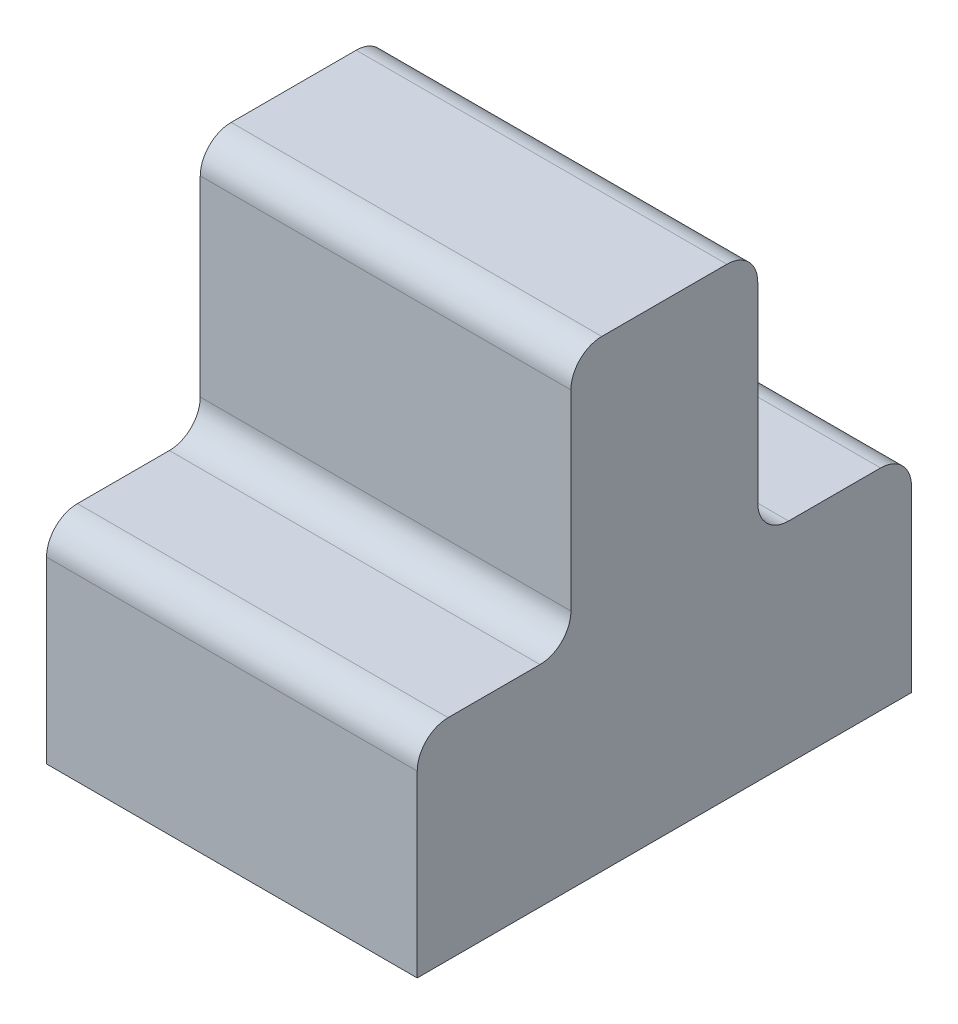
ISO-10303-21;
HEADER;
FILE_DESCRIPTION(('STEP AP214'),'2;1');
FILE_NAME('part.step','',(''),(''),'','','');
FILE_SCHEMA(('AUTOMOTIVE_DESIGN { 1 0 10303 214 1 1 1 1 }'));
ENDSEC;
DATA;
#1=APPLICATION_CONTEXT('core data for automotive mechanical design processes');
#2=APPLICATION_PROTOCOL_DEFINITION('international standard','automotive_design',2000,#1);
#3=PRODUCT_CONTEXT('',#1,'mechanical');
#4=PRODUCT('Part','Part','',(#3));
#5=PRODUCT_RELATED_PRODUCT_CATEGORY('part','',(#4));
#6=PRODUCT_DEFINITION_FORMATION('','',#4);
#7=PRODUCT_DEFINITION_CONTEXT('part definition',#1,'design');
#8=PRODUCT_DEFINITION('design','',#6,#7);
#9=PRODUCT_DEFINITION_SHAPE('','',#8);
#10=(LENGTH_UNIT() NAMED_UNIT(*) SI_UNIT(.MILLI.,.METRE.));
#11=(NAMED_UNIT(*) PLANE_ANGLE_UNIT() SI_UNIT($,.RADIAN.));
#12=(NAMED_UNIT(*) SI_UNIT($,.STERADIAN.) SOLID_ANGLE_UNIT());
#13=UNCERTAINTY_MEASURE_WITH_UNIT(LENGTH_MEASURE(1.E-05),#10,'distance_accuracy_value','');
#14=(GEOMETRIC_REPRESENTATION_CONTEXT(3) GLOBAL_UNCERTAINTY_ASSIGNED_CONTEXT((#13)) GLOBAL_UNIT_ASSIGNED_CONTEXT((#10,
#11,#12)) REPRESENTATION_CONTEXT('',''));
#15=CARTESIAN_POINT('',(0.,0.,0.));
#16=DIRECTION('',(0.,0.,1.));
#17=DIRECTION('',(1.,0.,0.));
#18=AXIS2_PLACEMENT_3D('',#15,#16,#17);
#19=CARTESIAN_POINT('',(12.,15.,0.));
#20=DIRECTION('',(0.,1.,0.));
#21=DIRECTION('',(0.,0.,1.));
#22=AXIS2_PLACEMENT_3D('',#19,#20,#21);
#23=PLANE('',#22);
#24=DIRECTION('',(0.,0.,-1.));
#25=VECTOR('',#24,1.);
#26=CARTESIAN_POINT('',(12.,15.,0.));
#27=LINE('',#26,#25);
#28=CARTESIAN_POINT('',(12.,15.,-5.97564679745089));
#29=VERTEX_POINT('',#28);
#30=CARTESIAN_POINT('',(12.,15.,-10.0243532025491));
#31=VERTEX_POINT('',#30);
#32=EDGE_CURVE('E195',#29,#31,#27,.T.);
#33=ORIENTED_EDGE('',*,*,#32,.T.);
#34=DIRECTION('',(-1.,0.,0.));
#35=VECTOR('',#34,1.);
#36=CARTESIAN_POINT('',(12.,15.,-10.0243532025491));
#37=LINE('',#36,#35);
#38=CARTESIAN_POINT('',(0.,15.,-10.0243532025491));
#39=VERTEX_POINT('',#38);
#40=EDGE_CURVE('E293',#31,#39,#37,.T.);
#41=ORIENTED_EDGE('',*,*,#40,.T.);
#42=DIRECTION('',(0.,0.,-1.));
#43=VECTOR('',#42,1.);
#44=CARTESIAN_POINT('',(0.,15.,0.));
#45=LINE('',#44,#43);
#46=CARTESIAN_POINT('',(0.,15.,-5.97564679745089));
#47=VERTEX_POINT('',#46);
#48=EDGE_CURVE('E170',#47,#39,#45,.T.);
#49=ORIENTED_EDGE('',*,*,#48,.F.);
#50=DIRECTION('',(-1.,0.,0.));
#51=VECTOR('',#50,1.);
#52=CARTESIAN_POINT('',(12.,15.,-5.97564679745089));
#53=LINE('',#52,#51);
#54=EDGE_CURVE('E257',#47,#29,#53,.F.);
#55=ORIENTED_EDGE('',*,*,#54,.T.);
#56=EDGE_LOOP('',(#33,#41,#49,#55));
#57=FACE_BOUND('',#56,.T.);
#58=ADVANCED_FACE('F47',(#57),#23,.T.);
#59=CARTESIAN_POINT('',(12.,0.,-4.97564679745089));
#60=DIRECTION('',(0.,0.,-1.));
#61=DIRECTION('',(0.,1.,0.));
#62=AXIS2_PLACEMENT_3D('',#59,#60,#61);
#63=PLANE('',#62);
#64=DIRECTION('',(0.,-1.,0.));
#65=VECTOR('',#64,1.);
#66=CARTESIAN_POINT('',(0.,0.,-4.97564679745089));
#67=LINE('',#66,#65);
#68=CARTESIAN_POINT('',(0.,14.,-4.97564679745089));
#69=VERTEX_POINT('',#68);
#70=CARTESIAN_POINT('',(0.,7.80047965465785,-4.97564679745089));
#71=VERTEX_POINT('',#70);
#72=EDGE_CURVE('E211',#69,#71,#67,.T.);
#73=ORIENTED_EDGE('',*,*,#72,.T.);
#74=DIRECTION('',(-1.,0.,0.));
#75=VECTOR('',#74,1.);
#76=CARTESIAN_POINT('',(12.,7.80047965465785,-4.97564679745089));
#77=LINE('',#76,#75);
#78=CARTESIAN_POINT('',(12.,7.80047965465785,-4.97564679745089));
#79=VERTEX_POINT('',#78);
#80=EDGE_CURVE('E254',#71,#79,#77,.F.);
#81=ORIENTED_EDGE('',*,*,#80,.T.);
#82=DIRECTION('',(0.,-1.,0.));
#83=VECTOR('',#82,1.);
#84=CARTESIAN_POINT('',(12.,0.,-4.97564679745089));
#85=LINE('',#84,#83);
#86=CARTESIAN_POINT('',(12.,14.,-4.97564679745089));
#87=VERTEX_POINT('',#86);
#88=EDGE_CURVE('E198',#87,#79,#85,.T.);
#89=ORIENTED_EDGE('',*,*,#88,.F.);
#90=DIRECTION('',(-1.,0.,0.));
#91=VECTOR('',#90,1.);
#92=CARTESIAN_POINT('',(0.,14.,-4.97564679745089));
#93=LINE('',#92,#91);
#94=EDGE_CURVE('E250',#87,#69,#93,.T.);
#95=ORIENTED_EDGE('',*,*,#94,.T.);
#96=EDGE_LOOP('',(#73,#81,#89,#95));
#97=FACE_BOUND('',#96,.T.);
#98=ADVANCED_FACE('F324',(#97),#63,.F.);
#99=CARTESIAN_POINT('',(12.,6.80047965465785,0.));
#100=DIRECTION('',(0.,1.,0.));
#101=DIRECTION('',(0.,0.,1.));
#102=AXIS2_PLACEMENT_3D('',#99,#100,#101);
#103=PLANE('',#102);
#104=DIRECTION('',(0.,0.,-1.));
#105=VECTOR('',#104,1.);
#106=CARTESIAN_POINT('',(0.,6.80047965465785,0.));
#107=LINE('',#106,#105);
#108=CARTESIAN_POINT('',(0.,6.80047965465785,-1.));
#109=VERTEX_POINT('',#108);
#110=CARTESIAN_POINT('',(0.,6.80047965465785,-3.97564679745089));
#111=VERTEX_POINT('',#110);
#112=EDGE_CURVE('E215',#109,#111,#107,.T.);
#113=ORIENTED_EDGE('',*,*,#112,.F.);
#114=DIRECTION('',(-1.,0.,0.));
#115=VECTOR('',#114,1.);
#116=CARTESIAN_POINT('',(12.,6.80047965465785,-1.));
#117=LINE('',#116,#115);
#118=CARTESIAN_POINT('',(12.,6.80047965465785,-1.));
#119=VERTEX_POINT('',#118);
#120=EDGE_CURVE('E241',#109,#119,#117,.F.);
#121=ORIENTED_EDGE('',*,*,#120,.T.);
#122=DIRECTION('',(0.,0.,-1.));
#123=VECTOR('',#122,1.);
#124=CARTESIAN_POINT('',(12.,6.80047965465785,0.));
#125=LINE('',#124,#123);
#126=CARTESIAN_POINT('',(12.,6.80047965465785,-3.97564679745089));
#127=VERTEX_POINT('',#126);
#128=EDGE_CURVE('E202',#119,#127,#125,.T.);
#129=ORIENTED_EDGE('',*,*,#128,.T.);
#130=DIRECTION('',(-1.,0.,0.));
#131=VECTOR('',#130,1.);
#132=CARTESIAN_POINT('',(12.,6.80047965465785,-3.97564679745089));
#133=LINE('',#132,#131);
#134=EDGE_CURVE('E237',#127,#111,#133,.T.);
#135=ORIENTED_EDGE('',*,*,#134,.T.);
#136=EDGE_LOOP('',(#113,#121,#129,#135));
#137=FACE_BOUND('',#136,.T.);
#138=ADVANCED_FACE('F333',(#137),#103,.T.);
#139=CARTESIAN_POINT('',(12.,0.,0.));
#140=DIRECTION('',(0.,0.,1.));
#141=DIRECTION('',(0.,-1.,0.));
#142=AXIS2_PLACEMENT_3D('',#139,#140,#141);
#143=PLANE('',#142);
#144=DIRECTION('',(0.,1.,0.));
#145=VECTOR('',#144,1.);
#146=CARTESIAN_POINT('',(12.,0.,0.));
#147=LINE('',#146,#145);
#148=CARTESIAN_POINT('',(12.,0.,0.));
#149=VERTEX_POINT('',#148);
#150=CARTESIAN_POINT('',(12.,5.80047965465785,0.));
#151=VERTEX_POINT('',#150);
#152=EDGE_CURVE('E156',#149,#151,#147,.T.);
#153=ORIENTED_EDGE('',*,*,#152,.T.);
#154=DIRECTION('',(-1.,0.,0.));
#155=VECTOR('',#154,1.);
#156=CARTESIAN_POINT('',(12.,5.80047965465785,0.));
#157=LINE('',#156,#155);
#158=CARTESIAN_POINT('',(0.,5.80047965465785,0.));
#159=VERTEX_POINT('',#158);
#160=EDGE_CURVE('E227',#151,#159,#157,.T.);
#161=ORIENTED_EDGE('',*,*,#160,.T.);
#162=DIRECTION('',(0.,1.,0.));
#163=VECTOR('',#162,1.);
#164=CARTESIAN_POINT('',(0.,0.,0.));
#165=LINE('',#164,#163);
#166=CARTESIAN_POINT('',(0.,0.,0.));
#167=VERTEX_POINT('',#166);
#168=EDGE_CURVE('E219',#167,#159,#165,.T.);
#169=ORIENTED_EDGE('',*,*,#168,.F.);
#170=DIRECTION('',(-1.,0.,0.));
#171=VECTOR('',#170,1.);
#172=CARTESIAN_POINT('',(12.,0.,0.));
#173=LINE('',#172,#171);
#174=EDGE_CURVE('E159',#149,#167,#173,.T.);
#175=ORIENTED_EDGE('',*,*,#174,.F.);
#176=EDGE_LOOP('',(#153,#161,#169,#175));
#177=FACE_BOUND('',#176,.T.);
#178=ADVANCED_FACE('F341',(#177),#143,.T.);
#179=CARTESIAN_POINT('',(12.,0.,0.));
#180=DIRECTION('',(0.,1.,0.));
#181=DIRECTION('',(0.,0.,1.));
#182=AXIS2_PLACEMENT_3D('',#179,#180,#181);
#183=PLANE('',#182);
#184=DIRECTION('',(0.,0.,-1.));
#185=VECTOR('',#184,1.);
#186=CARTESIAN_POINT('',(0.,0.,0.));
#187=LINE('',#186,#185);
#188=CARTESIAN_POINT('',(0.,0.,-16.));
#189=VERTEX_POINT('',#188);
#190=EDGE_CURVE('E165',#167,#189,#187,.T.);
#191=ORIENTED_EDGE('',*,*,#190,.T.);
#192=DIRECTION('',(-1.,0.,0.));
#193=VECTOR('',#192,1.);
#194=CARTESIAN_POINT('',(12.,0.,-16.));
#195=LINE('',#194,#193);
#196=CARTESIAN_POINT('',(12.,0.,-16.));
#197=VERTEX_POINT('',#196);
#198=EDGE_CURVE('E162',#197,#189,#195,.T.);
#199=ORIENTED_EDGE('',*,*,#198,.F.);
#200=DIRECTION('',(0.,0.,-1.));
#201=VECTOR('',#200,1.);
#202=CARTESIAN_POINT('',(12.,0.,0.));
#203=LINE('',#202,#201);
#204=EDGE_CURVE('E149',#149,#197,#203,.T.);
#205=ORIENTED_EDGE('',*,*,#204,.F.);
#206=ORIENTED_EDGE('',*,*,#174,.T.);
#207=EDGE_LOOP('',(#191,#199,#205,#206));
#208=FACE_BOUND('',#207,.T.);
#209=ADVANCED_FACE('F163',(#208),#183,.F.);
#210=CARTESIAN_POINT('',(12.,0.,0.));
#211=DIRECTION('',(1.,0.,0.));
#212=DIRECTION('',(0.,0.,-1.));
#213=AXIS2_PLACEMENT_3D('',#210,#211,#212);
#214=PLANE('',#213);
#215=DIRECTION('',(0.,1.,0.));
#216=VECTOR('',#215,1.);
#217=CARTESIAN_POINT('',(12.,0.,-16.));
#218=LINE('',#217,#216);
#219=CARTESIAN_POINT('',(12.,5.80047965465785,-16.));
#220=VERTEX_POINT('',#219);
#221=EDGE_CURVE('E153',#197,#220,#218,.T.);
#222=ORIENTED_EDGE('',*,*,#221,.T.);
#223=CARTESIAN_POINT('',(12.,5.80047965465785,-15.));
#224=DIRECTION('',(1.,0.,0.));
#225=DIRECTION('',(0.,0.,-1.));
#226=AXIS2_PLACEMENT_3D('',#223,#224,#225);
#227=CIRCLE('',#226,1.);
#228=CARTESIAN_POINT('',(12.,6.80047965465785,-15.));
#229=VERTEX_POINT('',#228);
#230=EDGE_CURVE('E283',#220,#229,#227,.T.);
#231=ORIENTED_EDGE('',*,*,#230,.T.);
#232=DIRECTION('',(0.,0.,1.));
#233=VECTOR('',#232,1.);
#234=CARTESIAN_POINT('',(12.,6.80047965465785,-16.));
#235=LINE('',#234,#233);
#236=CARTESIAN_POINT('',(12.,6.80047965465785,-12.0243532025491));
#237=VERTEX_POINT('',#236);
#238=EDGE_CURVE('E177',#229,#237,#235,.T.);
#239=ORIENTED_EDGE('',*,*,#238,.T.);
#240=CARTESIAN_POINT('',(12.,7.80047965465785,-12.0243532025491));
#241=DIRECTION('',(1.,0.,0.));
#242=DIRECTION('',(0.,0.,-1.));
#243=AXIS2_PLACEMENT_3D('',#240,#241,#242);
#244=CIRCLE('',#243,1.);
#245=CARTESIAN_POINT('',(12.,7.80047965465785,-11.0243532025491));
#246=VERTEX_POINT('',#245);
#247=EDGE_CURVE('E11',#237,#246,#244,.F.);
#248=ORIENTED_EDGE('',*,*,#247,.T.);
#249=DIRECTION('',(0.,-1.,0.));
#250=VECTOR('',#249,1.);
#251=CARTESIAN_POINT('',(12.,0.,-11.0243532025491));
#252=LINE('',#251,#250);
#253=CARTESIAN_POINT('',(12.,14.,-11.0243532025491));
#254=VERTEX_POINT('',#253);
#255=EDGE_CURVE('E171',#254,#246,#252,.T.);
#256=ORIENTED_EDGE('',*,*,#255,.F.);
#257=CARTESIAN_POINT('',(12.,14.,-10.0243532025491));
#258=DIRECTION('',(1.,0.,0.));
#259=DIRECTION('',(0.,0.,-1.));
#260=AXIS2_PLACEMENT_3D('',#257,#258,#259);
#261=CIRCLE('',#260,1.);
#262=EDGE_CURVE('E63',#254,#31,#261,.T.);
#263=ORIENTED_EDGE('',*,*,#262,.T.);
#264=ORIENTED_EDGE('',*,*,#32,.F.);
#265=CARTESIAN_POINT('',(12.,14.,-5.97564679745089));
#266=DIRECTION('',(1.,0.,0.));
#267=DIRECTION('',(0.,0.,-1.));
#268=AXIS2_PLACEMENT_3D('',#265,#266,#267);
#269=CIRCLE('',#268,1.);
#270=EDGE_CURVE('E244',#29,#87,#269,.T.);
#271=ORIENTED_EDGE('',*,*,#270,.T.);
#272=ORIENTED_EDGE('',*,*,#88,.T.);
#273=CARTESIAN_POINT('',(12.,7.80047965465785,-3.97564679745089));
#274=DIRECTION('',(1.,0.,0.));
#275=DIRECTION('',(0.,0.,-1.));
#276=AXIS2_PLACEMENT_3D('',#273,#274,#275);
#277=CIRCLE('',#276,1.);
#278=EDGE_CURVE('E263',#79,#127,#277,.F.);
#279=ORIENTED_EDGE('',*,*,#278,.T.);
#280=ORIENTED_EDGE('',*,*,#128,.F.);
#281=CARTESIAN_POINT('',(12.,5.80047965465785,-1.));
#282=DIRECTION('',(1.,0.,0.));
#283=DIRECTION('',(0.,0.,-1.));
#284=AXIS2_PLACEMENT_3D('',#281,#282,#283);
#285=CIRCLE('',#284,1.);
#286=EDGE_CURVE('E247',#119,#151,#285,.T.);
#287=ORIENTED_EDGE('',*,*,#286,.T.);
#288=ORIENTED_EDGE('',*,*,#152,.F.);
#289=ORIENTED_EDGE('',*,*,#204,.T.);
#290=EDGE_LOOP('',(#222,#231,#239,#248,#256,#263,#264,#271,#272,#279,#280,#287,#288,#289));
#291=FACE_BOUND('',#290,.T.);
#292=ADVANCED_FACE('F151',(#291),#214,.T.);
#293=CARTESIAN_POINT('',(0.,0.,0.));
#294=DIRECTION('',(1.,0.,0.));
#295=DIRECTION('',(0.,0.,-1.));
#296=AXIS2_PLACEMENT_3D('',#293,#294,#295);
#297=PLANE('',#296);
#298=DIRECTION('',(0.,0.,1.));
#299=VECTOR('',#298,1.);
#300=CARTESIAN_POINT('',(0.,6.80047965465785,-16.));
#301=LINE('',#300,#299);
#302=CARTESIAN_POINT('',(0.,6.80047965465785,-15.));
#303=VERTEX_POINT('',#302);
#304=CARTESIAN_POINT('',(0.,6.80047965465785,-12.0243532025491));
#305=VERTEX_POINT('',#304);
#306=EDGE_CURVE('E184',#303,#305,#301,.T.);
#307=ORIENTED_EDGE('',*,*,#306,.F.);
#308=CARTESIAN_POINT('',(0.,5.80047965465785,-15.));
#309=DIRECTION('',(1.,0.,0.));
#310=DIRECTION('',(0.,0.,-1.));
#311=AXIS2_PLACEMENT_3D('',#308,#309,#310);
#312=CIRCLE('',#311,1.);
#313=CARTESIAN_POINT('',(0.,5.80047965465785,-16.));
#314=VERTEX_POINT('',#313);
#315=EDGE_CURVE('E276',#303,#314,#312,.F.);
#316=ORIENTED_EDGE('',*,*,#315,.T.);
#317=DIRECTION('',(0.,1.,0.));
#318=VECTOR('',#317,1.);
#319=CARTESIAN_POINT('',(0.,0.,-16.));
#320=LINE('',#319,#318);
#321=EDGE_CURVE('E189',#189,#314,#320,.T.);
#322=ORIENTED_EDGE('',*,*,#321,.F.);
#323=ORIENTED_EDGE('',*,*,#190,.F.);
#324=ORIENTED_EDGE('',*,*,#168,.T.);
#325=CARTESIAN_POINT('',(0.,5.80047965465785,-1.));
#326=DIRECTION('',(1.,0.,0.));
#327=DIRECTION('',(0.,0.,-1.));
#328=AXIS2_PLACEMENT_3D('',#325,#326,#327);
#329=CIRCLE('',#328,1.);
#330=EDGE_CURVE('E234',#159,#109,#329,.F.);
#331=ORIENTED_EDGE('',*,*,#330,.T.);
#332=ORIENTED_EDGE('',*,*,#112,.T.);
#333=CARTESIAN_POINT('',(0.,7.80047965465785,-3.97564679745089));
#334=DIRECTION('',(1.,0.,0.));
#335=DIRECTION('',(0.,0.,-1.));
#336=AXIS2_PLACEMENT_3D('',#333,#334,#335);
#337=CIRCLE('',#336,1.);
#338=EDGE_CURVE('E260',#111,#71,#337,.T.);
#339=ORIENTED_EDGE('',*,*,#338,.T.);
#340=ORIENTED_EDGE('',*,*,#72,.F.);
#341=CARTESIAN_POINT('',(0.,14.,-5.97564679745089));
#342=DIRECTION('',(1.,0.,0.));
#343=DIRECTION('',(0.,0.,-1.));
#344=AXIS2_PLACEMENT_3D('',#341,#342,#343);
#345=CIRCLE('',#344,1.);
#346=EDGE_CURVE('E231',#69,#47,#345,.F.);
#347=ORIENTED_EDGE('',*,*,#346,.T.);
#348=ORIENTED_EDGE('',*,*,#48,.T.);
#349=CARTESIAN_POINT('',(0.,14.,-10.0243532025491));
#350=DIRECTION('',(1.,0.,0.));
#351=DIRECTION('',(0.,0.,-1.));
#352=AXIS2_PLACEMENT_3D('',#349,#350,#351);
#353=CIRCLE('',#352,1.);
#354=CARTESIAN_POINT('',(0.,14.,-11.0243532025491));
#355=VERTEX_POINT('',#354);
#356=EDGE_CURVE('E273',#39,#355,#353,.F.);
#357=ORIENTED_EDGE('',*,*,#356,.T.);
#358=DIRECTION('',(0.,-1.,0.));
#359=VECTOR('',#358,1.);
#360=CARTESIAN_POINT('',(0.,0.,-11.0243532025491));
#361=LINE('',#360,#359);
#362=CARTESIAN_POINT('',(0.,7.80047965465785,-11.0243532025491));
#363=VERTEX_POINT('',#362);
#364=EDGE_CURVE('E178',#355,#363,#361,.T.);
#365=ORIENTED_EDGE('',*,*,#364,.T.);
#366=CARTESIAN_POINT('',(0.,7.80047965465785,-12.0243532025491));
#367=DIRECTION('',(1.,0.,0.));
#368=DIRECTION('',(0.,0.,-1.));
#369=AXIS2_PLACEMENT_3D('',#366,#367,#368);
#370=CIRCLE('',#369,1.);
#371=EDGE_CURVE('E56',#363,#305,#370,.T.);
#372=ORIENTED_EDGE('',*,*,#371,.T.);
#373=EDGE_LOOP('',(#307,#316,#322,#323,#324,#331,#332,#339,#340,#347,#348,#357,#365,#372));
#374=FACE_BOUND('',#373,.T.);
#375=ADVANCED_FACE('F299',(#374),#297,.F.);
#376=CARTESIAN_POINT('',(12.,5.80047965465785,-1.));
#377=DIRECTION('',(-1.,0.,0.));
#378=DIRECTION('',(0.,0.,1.));
#379=AXIS2_PLACEMENT_3D('',#376,#377,#378);
#380=CYLINDRICAL_SURFACE('',#379,1.);
#381=ORIENTED_EDGE('',*,*,#286,.F.);
#382=ORIENTED_EDGE('',*,*,#120,.F.);
#383=ORIENTED_EDGE('',*,*,#330,.F.);
#384=ORIENTED_EDGE('',*,*,#160,.F.);
#385=EDGE_LOOP('',(#381,#382,#383,#384));
#386=FACE_BOUND('',#385,.T.);
#387=ADVANCED_FACE('F339',(#386),#380,.T.);
#388=CARTESIAN_POINT('',(12.,7.80047965465785,-3.97564679745089));
#389=DIRECTION('',(-1.,0.,0.));
#390=DIRECTION('',(0.,0.,1.));
#391=AXIS2_PLACEMENT_3D('',#388,#389,#390);
#392=CYLINDRICAL_SURFACE('',#391,1.);
#393=ORIENTED_EDGE('',*,*,#278,.F.);
#394=ORIENTED_EDGE('',*,*,#80,.F.);
#395=ORIENTED_EDGE('',*,*,#338,.F.);
#396=ORIENTED_EDGE('',*,*,#134,.F.);
#397=EDGE_LOOP('',(#393,#394,#395,#396));
#398=FACE_BOUND('',#397,.T.);
#399=ADVANCED_FACE('F330',(#398),#392,.F.);
#400=CARTESIAN_POINT('',(12.,14.,-5.97564679745089));
#401=DIRECTION('',(1.,0.,0.));
#402=DIRECTION('',(0.,0.,-1.));
#403=AXIS2_PLACEMENT_3D('',#400,#401,#402);
#404=CYLINDRICAL_SURFACE('',#403,1.);
#405=ORIENTED_EDGE('',*,*,#270,.F.);
#406=ORIENTED_EDGE('',*,*,#54,.F.);
#407=ORIENTED_EDGE('',*,*,#346,.F.);
#408=ORIENTED_EDGE('',*,*,#94,.F.);
#409=EDGE_LOOP('',(#405,#406,#407,#408));
#410=FACE_BOUND('',#409,.T.);
#411=ADVANCED_FACE('F321',(#410),#404,.T.);
#412=CARTESIAN_POINT('',(12.,0.,-16.));
#413=DIRECTION('',(0.,0.,1.));
#414=DIRECTION('',(0.,-1.,0.));
#415=AXIS2_PLACEMENT_3D('',#412,#413,#414);
#416=PLANE('',#415);
#417=ORIENTED_EDGE('',*,*,#321,.T.);
#418=DIRECTION('',(-1.,0.,0.));
#419=VECTOR('',#418,1.);
#420=CARTESIAN_POINT('',(12.,5.80047965465785,-16.));
#421=LINE('',#420,#419);
#422=EDGE_CURVE('E175',#314,#220,#421,.F.);
#423=ORIENTED_EDGE('',*,*,#422,.T.);
#424=ORIENTED_EDGE('',*,*,#221,.F.);
#425=ORIENTED_EDGE('',*,*,#198,.T.);
#426=EDGE_LOOP('',(#417,#423,#424,#425));
#427=FACE_BOUND('',#426,.T.);
#428=ADVANCED_FACE('F173',(#427),#416,.F.);
#429=CARTESIAN_POINT('',(12.,6.80047965465785,-16.));
#430=DIRECTION('',(0.,-1.,0.));
#431=DIRECTION('',(0.,0.,-1.));
#432=AXIS2_PLACEMENT_3D('',#429,#430,#431);
#433=PLANE('',#432);
#434=ORIENTED_EDGE('',*,*,#238,.F.);
#435=DIRECTION('',(-1.,0.,0.));
#436=VECTOR('',#435,1.);
#437=CARTESIAN_POINT('',(12.,6.80047965465785,-15.));
#438=LINE('',#437,#436);
#439=EDGE_CURVE('E269',#229,#303,#438,.T.);
#440=ORIENTED_EDGE('',*,*,#439,.T.);
#441=ORIENTED_EDGE('',*,*,#306,.T.);
#442=DIRECTION('',(-1.,0.,0.));
#443=VECTOR('',#442,1.);
#444=CARTESIAN_POINT('',(12.,6.80047965465785,-12.0243532025491));
#445=LINE('',#444,#443);
#446=EDGE_CURVE('E266',#305,#237,#445,.F.);
#447=ORIENTED_EDGE('',*,*,#446,.T.);
#448=EDGE_LOOP('',(#434,#440,#441,#447));
#449=FACE_BOUND('',#448,.T.);
#450=ADVANCED_FACE('F306',(#449),#433,.F.);
#451=CARTESIAN_POINT('',(12.,0.,-11.0243532025491));
#452=DIRECTION('',(0.,0.,-1.));
#453=DIRECTION('',(0.,1.,0.));
#454=AXIS2_PLACEMENT_3D('',#451,#452,#453);
#455=PLANE('',#454);
#456=ORIENTED_EDGE('',*,*,#255,.T.);
#457=DIRECTION('',(-1.,0.,0.));
#458=VECTOR('',#457,1.);
#459=CARTESIAN_POINT('',(12.,7.80047965465785,-11.0243532025491));
#460=LINE('',#459,#458);
#461=EDGE_CURVE('E289',#246,#363,#460,.T.);
#462=ORIENTED_EDGE('',*,*,#461,.T.);
#463=ORIENTED_EDGE('',*,*,#364,.F.);
#464=DIRECTION('',(-1.,0.,0.));
#465=VECTOR('',#464,1.);
#466=CARTESIAN_POINT('',(12.,14.,-11.0243532025491));
#467=LINE('',#466,#465);
#468=EDGE_CURVE('E286',#355,#254,#467,.F.);
#469=ORIENTED_EDGE('',*,*,#468,.T.);
#470=EDGE_LOOP('',(#456,#462,#463,#469));
#471=FACE_BOUND('',#470,.T.);
#472=ADVANCED_FACE('F310',(#471),#455,.T.);
#473=CARTESIAN_POINT('',(12.,5.80047965465785,-15.));
#474=DIRECTION('',(-1.,0.,0.));
#475=DIRECTION('',(0.,0.,1.));
#476=AXIS2_PLACEMENT_3D('',#473,#474,#475);
#477=CYLINDRICAL_SURFACE('',#476,1.);
#478=ORIENTED_EDGE('',*,*,#230,.F.);
#479=ORIENTED_EDGE('',*,*,#422,.F.);
#480=ORIENTED_EDGE('',*,*,#315,.F.);
#481=ORIENTED_EDGE('',*,*,#439,.F.);
#482=EDGE_LOOP('',(#478,#479,#480,#481));
#483=FACE_BOUND('',#482,.T.);
#484=ADVANCED_FACE('F343',(#483),#477,.T.);
#485=CARTESIAN_POINT('',(12.,7.80047965465785,-12.0243532025491));
#486=DIRECTION('',(-1.,0.,0.));
#487=DIRECTION('',(0.,0.,1.));
#488=AXIS2_PLACEMENT_3D('',#485,#486,#487);
#489=CYLINDRICAL_SURFACE('',#488,1.);
#490=ORIENTED_EDGE('',*,*,#247,.F.);
#491=ORIENTED_EDGE('',*,*,#446,.F.);
#492=ORIENTED_EDGE('',*,*,#371,.F.);
#493=ORIENTED_EDGE('',*,*,#461,.F.);
#494=EDGE_LOOP('',(#490,#491,#492,#493));
#495=FACE_BOUND('',#494,.T.);
#496=ADVANCED_FACE('F308',(#495),#489,.F.);
#497=CARTESIAN_POINT('',(12.,14.,-10.0243532025491));
#498=DIRECTION('',(-1.,0.,0.));
#499=DIRECTION('',(0.,0.,1.));
#500=AXIS2_PLACEMENT_3D('',#497,#498,#499);
#501=CYLINDRICAL_SURFACE('',#500,1.);
#502=ORIENTED_EDGE('',*,*,#262,.F.);
#503=ORIENTED_EDGE('',*,*,#468,.F.);
#504=ORIENTED_EDGE('',*,*,#356,.F.);
#505=ORIENTED_EDGE('',*,*,#40,.F.);
#506=EDGE_LOOP('',(#502,#503,#504,#505));
#507=FACE_BOUND('',#506,.T.);
#508=ADVANCED_FACE('F49',(#507),#501,.T.);
#509=CLOSED_SHELL('',(#58,#98,#138,#178,#209,#292,#375,#387,#399,#411,#428,#450,#472,#484,#496,#508));
#510=MANIFOLD_SOLID_BREP('B2',#509);
#511=ADVANCED_BREP_SHAPE_REPRESENTATION('',(#18,#510),#14);
#512=SHAPE_DEFINITION_REPRESENTATION(#9,#511);
ENDSEC;
END-ISO-10303-21;
